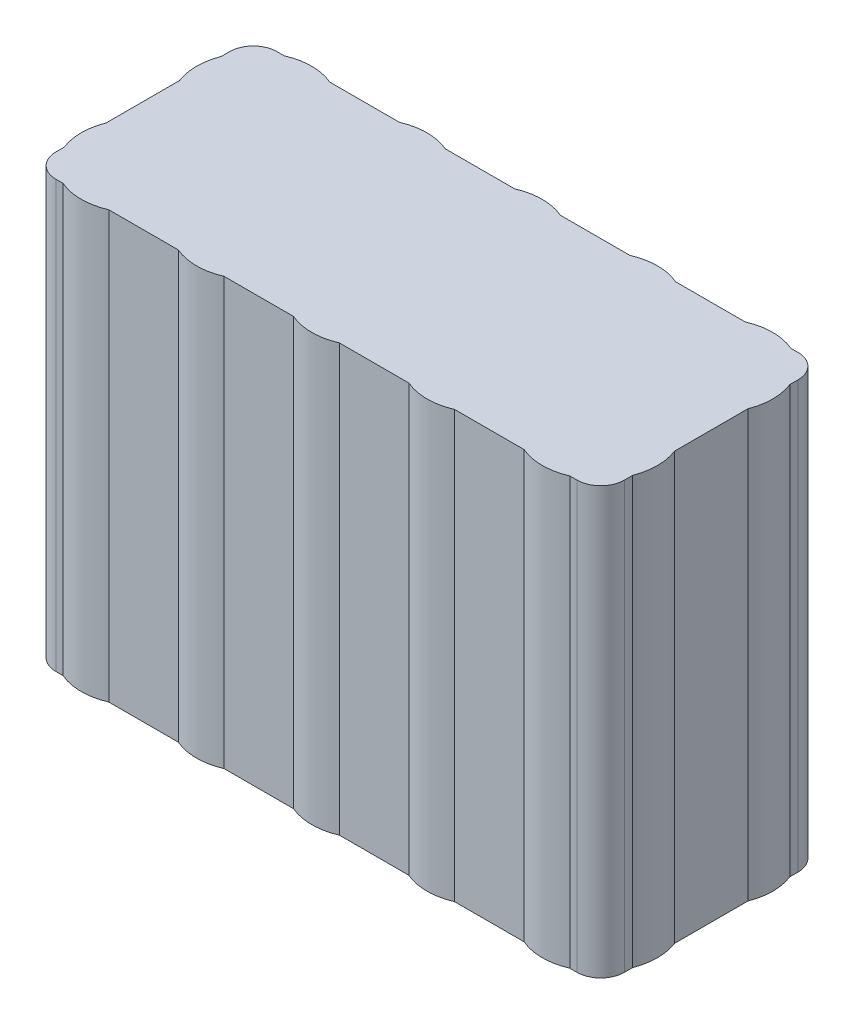
ISO-10303-21;
HEADER;
FILE_DESCRIPTION(('STEP AP214'),'2;1');
FILE_NAME('part.step','',(''),(''),'','','');
FILE_SCHEMA(('AUTOMOTIVE_DESIGN { 1 0 10303 214 1 1 1 1 }'));
ENDSEC;
DATA;
#1=APPLICATION_CONTEXT('core data for automotive mechanical design processes');
#2=APPLICATION_PROTOCOL_DEFINITION('international standard','automotive_design',2000,#1);
#3=PRODUCT_CONTEXT('',#1,'mechanical');
#4=PRODUCT('Part','Part','',(#3));
#5=PRODUCT_RELATED_PRODUCT_CATEGORY('part','',(#4));
#6=PRODUCT_DEFINITION_FORMATION('','',#4);
#7=PRODUCT_DEFINITION_CONTEXT('part definition',#1,'design');
#8=PRODUCT_DEFINITION('design','',#6,#7);
#9=PRODUCT_DEFINITION_SHAPE('','',#8);
#10=(LENGTH_UNIT() NAMED_UNIT(*) SI_UNIT(.MILLI.,.METRE.));
#11=(NAMED_UNIT(*) PLANE_ANGLE_UNIT() SI_UNIT($,.RADIAN.));
#12=(NAMED_UNIT(*) SI_UNIT($,.STERADIAN.) SOLID_ANGLE_UNIT());
#13=UNCERTAINTY_MEASURE_WITH_UNIT(LENGTH_MEASURE(1.E-05),#10,'distance_accuracy_value','');
#14=(GEOMETRIC_REPRESENTATION_CONTEXT(3) GLOBAL_UNCERTAINTY_ASSIGNED_CONTEXT((#13)) GLOBAL_UNIT_ASSIGNED_CONTEXT((#10,
#11,#12)) REPRESENTATION_CONTEXT('',''));
#15=CARTESIAN_POINT('',(0.,0.,0.));
#16=DIRECTION('',(0.,0.,1.));
#17=DIRECTION('',(1.,0.,0.));
#18=AXIS2_PLACEMENT_3D('',#15,#16,#17);
#19=CARTESIAN_POINT('',(-34.6305945179053,54.,0.));
#20=DIRECTION('',(-1.,0.,0.));
#21=DIRECTION('',(0.,0.,1.));
#22=AXIS2_PLACEMENT_3D('',#19,#20,#21);
#23=PLANE('',#22);
#24=DIRECTION('',(0.,-1.,0.));
#25=VECTOR('',#24,1.);
#26=CARTESIAN_POINT('',(-34.6305945179053,54.,-6.47462959398208));
#27=LINE('',#26,#25);
#28=CARTESIAN_POINT('',(-34.6305945179053,54.,-6.47462959398208));
#29=VERTEX_POINT('',#28);
#30=CARTESIAN_POINT('',(-34.6305945179053,0.,-6.47462959398208));
#31=VERTEX_POINT('',#30);
#32=EDGE_CURVE('E401',#29,#31,#27,.T.);
#33=ORIENTED_EDGE('',*,*,#32,.F.);
#34=DIRECTION('',(0.,0.,-1.));
#35=VECTOR('',#34,1.);
#36=CARTESIAN_POINT('',(-34.6305945179053,54.,0.));
#37=LINE('',#36,#35);
#38=CARTESIAN_POINT('',(-34.6305945179053,54.,-7.51944598451169));
#39=VERTEX_POINT('',#38);
#40=EDGE_CURVE('E659',#29,#39,#37,.T.);
#41=ORIENTED_EDGE('',*,*,#40,.T.);
#42=DIRECTION('',(0.,-1.,0.));
#43=VECTOR('',#42,1.);
#44=CARTESIAN_POINT('',(-34.6305945179053,54.,-7.51944598451169));
#45=LINE('',#44,#43);
#46=CARTESIAN_POINT('',(-34.6305945179053,0.,-7.51944598451169));
#47=VERTEX_POINT('',#46);
#48=EDGE_CURVE('E674',#39,#47,#45,.T.);
#49=ORIENTED_EDGE('',*,*,#48,.T.);
#50=DIRECTION('',(0.,0.,-1.));
#51=VECTOR('',#50,1.);
#52=CARTESIAN_POINT('',(-34.6305945179053,0.,0.));
#53=LINE('',#52,#51);
#54=EDGE_CURVE('E662',#31,#47,#53,.T.);
#55=ORIENTED_EDGE('',*,*,#54,.F.);
#56=EDGE_LOOP('',(#33,#41,#49,#55));
#57=FACE_BOUND('',#56,.T.);
#58=ADVANCED_FACE('F397',(#57),#23,.T.);
#59=CARTESIAN_POINT('',(0.,0.,0.));
#60=DIRECTION('',(0.,1.,0.));
#61=DIRECTION('',(0.,0.,1.));
#62=AXIS2_PLACEMENT_3D('',#59,#60,#61);
#63=PLANE('',#62);
#64=DIRECTION('',(1.,0.,0.));
#65=VECTOR('',#64,1.);
#66=CARTESIAN_POINT('',(-31.6305945179053,0.,17.4805540154883));
#67=LINE('',#66,#65);
#68=CARTESIAN_POINT('',(-10.3323191686675,0.,17.4805540154883));
#69=VERTEX_POINT('',#68);
#70=CARTESIAN_POINT('',(-1.52886986714318,0.,17.4805540154883));
#71=VERTEX_POINT('',#70);
#72=EDGE_CURVE('E1019',#69,#71,#67,.T.);
#73=ORIENTED_EDGE('',*,*,#72,.F.);
#74=CARTESIAN_POINT('',(-13.2305945179053,0.,10.7805540154883));
#75=DIRECTION('',(0.,1.,0.));
#76=DIRECTION('',(0.,0.,1.));
#77=AXIS2_PLACEMENT_3D('',#74,#75,#76);
#78=CIRCLE('',#77,7.3);
#79=CARTESIAN_POINT('',(-16.1288698671432,0.,17.4805540154883));
#80=VERTEX_POINT('',#79);
#81=EDGE_CURVE('E761',#80,#69,#78,.T.);
#82=ORIENTED_EDGE('',*,*,#81,.F.);
#83=CARTESIAN_POINT('',(-24.9323191686675,0.,17.4805540154883));
#84=VERTEX_POINT('',#83);
#85=EDGE_CURVE('E719',#84,#80,#67,.T.);
#86=ORIENTED_EDGE('',*,*,#85,.F.);
#87=CARTESIAN_POINT('',(-27.8305945179053,0.,10.7805540154883));
#88=DIRECTION('',(0.,1.,0.));
#89=DIRECTION('',(0.,0.,1.));
#90=AXIS2_PLACEMENT_3D('',#87,#88,#89);
#91=CIRCLE('',#90,7.3);
#92=CARTESIAN_POINT('',(-30.7288698671432,0.,17.4805540154883));
#93=VERTEX_POINT('',#92);
#94=EDGE_CURVE('E755',#93,#84,#91,.T.);
#95=ORIENTED_EDGE('',*,*,#94,.F.);
#96=CARTESIAN_POINT('',(-31.6305945179053,0.,17.4805540154883));
#97=VERTEX_POINT('',#96);
#98=EDGE_CURVE('E715',#97,#93,#67,.T.);
#99=ORIENTED_EDGE('',*,*,#98,.F.);
#100=CARTESIAN_POINT('',(-31.6305945179053,0.,14.4805540154883));
#101=DIRECTION('',(0.,1.,0.));
#102=DIRECTION('',(0.,0.,1.));
#103=AXIS2_PLACEMENT_3D('',#100,#101,#102);
#104=CIRCLE('',#103,3.);
#105=CARTESIAN_POINT('',(-34.6305945179053,0.,14.4805540154883));
#106=VERTEX_POINT('',#105);
#107=EDGE_CURVE('E710',#106,#97,#104,.T.);
#108=ORIENTED_EDGE('',*,*,#107,.F.);
#109=DIRECTION('',(0.,0.,-1.));
#110=VECTOR('',#109,1.);
#111=CARTESIAN_POINT('',(-34.6305945179053,0.,14.4805540154883));
#112=LINE('',#111,#110);
#113=CARTESIAN_POINT('',(-34.6305945179053,0.,13.4357376249586));
#114=VERTEX_POINT('',#113);
#115=EDGE_CURVE('E688',#106,#114,#112,.T.);
#116=ORIENTED_EDGE('',*,*,#115,.T.);
#117=CARTESIAN_POINT('',(-34.6305945179053,0.,8.12537040601791));
#118=VERTEX_POINT('',#117);
#119=EDGE_CURVE('E754',#118,#114,#91,.T.);
#120=ORIENTED_EDGE('',*,*,#119,.F.);
#121=CARTESIAN_POINT('',(-34.6305945179053,0.,-1.16426237504136));
#122=VERTEX_POINT('',#121);
#123=EDGE_CURVE('E657',#118,#122,#53,.T.);
#124=ORIENTED_EDGE('',*,*,#123,.T.);
#125=CARTESIAN_POINT('',(-27.8305945179053,0.,-3.81944598451172));
#126=DIRECTION('',(0.,1.,0.));
#127=DIRECTION('',(0.,0.,1.));
#128=AXIS2_PLACEMENT_3D('',#125,#126,#127);
#129=CIRCLE('',#128,7.3);
#130=EDGE_CURVE('E680',#31,#122,#129,.T.);
#131=ORIENTED_EDGE('',*,*,#130,.F.);
#132=ORIENTED_EDGE('',*,*,#54,.T.);
#133=CARTESIAN_POINT('',(-31.6305945179053,0.,-7.51944598451171));
#134=DIRECTION('',(0.,1.,0.));
#135=DIRECTION('',(0.,0.,1.));
#136=AXIS2_PLACEMENT_3D('',#133,#134,#135);
#137=CIRCLE('',#136,3.);
#138=CARTESIAN_POINT('',(-31.6305945179053,0.,-10.5194459845117));
#139=VERTEX_POINT('',#138);
#140=EDGE_CURVE('E670',#47,#139,#137,.F.);
#141=ORIENTED_EDGE('',*,*,#140,.T.);
#142=DIRECTION('',(1.,0.,0.));
#143=VECTOR('',#142,1.);
#144=CARTESIAN_POINT('',(0.,0.,-10.5194459845117));
#145=LINE('',#144,#143);
#146=CARTESIAN_POINT('',(-30.7288698671432,0.,-10.5194459845117));
#147=VERTEX_POINT('',#146);
#148=EDGE_CURVE('E650',#139,#147,#145,.T.);
#149=ORIENTED_EDGE('',*,*,#148,.T.);
#150=CARTESIAN_POINT('',(-24.9323191686674,0.,-10.5194459845117));
#151=VERTEX_POINT('',#150);
#152=EDGE_CURVE('E635',#151,#147,#129,.T.);
#153=ORIENTED_EDGE('',*,*,#152,.F.);
#154=DIRECTION('',(1.,0.,0.));
#155=VECTOR('',#154,1.);
#156=CARTESIAN_POINT('',(-31.6305945179053,0.,-10.5194459845117));
#157=LINE('',#156,#155);
#158=CARTESIAN_POINT('',(-16.1288698671432,0.,-10.5194459845117));
#159=VERTEX_POINT('',#158);
#160=EDGE_CURVE('E730',#151,#159,#157,.T.);
#161=ORIENTED_EDGE('',*,*,#160,.T.);
#162=CARTESIAN_POINT('',(-13.2305945179053,0.,-3.81944598451173));
#163=DIRECTION('',(0.,1.,0.));
#164=DIRECTION('',(0.,0.,1.));
#165=AXIS2_PLACEMENT_3D('',#162,#163,#164);
#166=CIRCLE('',#165,7.3);
#167=CARTESIAN_POINT('',(-10.3323191686674,0.,-10.5194459845117));
#168=VERTEX_POINT('',#167);
#169=EDGE_CURVE('E806',#168,#159,#166,.T.);
#170=ORIENTED_EDGE('',*,*,#169,.F.);
#171=CARTESIAN_POINT('',(-1.52886986714324,0.,-10.5194459845117));
#172=VERTEX_POINT('',#171);
#173=EDGE_CURVE('E732',#168,#172,#157,.T.);
#174=ORIENTED_EDGE('',*,*,#173,.T.);
#175=CARTESIAN_POINT('',(1.36940548209466,0.,-3.81944598451173));
#176=DIRECTION('',(0.,1.,0.));
#177=DIRECTION('',(0.,0.,1.));
#178=AXIS2_PLACEMENT_3D('',#175,#176,#177);
#179=CIRCLE('',#178,7.29999999999999);
#180=CARTESIAN_POINT('',(4.26768083133256,0.,-10.5194459845117));
#181=VERTEX_POINT('',#180);
#182=EDGE_CURVE('E801',#181,#172,#179,.T.);
#183=ORIENTED_EDGE('',*,*,#182,.F.);
#184=CARTESIAN_POINT('',(13.0711301328568,0.,-10.5194459845117));
#185=VERTEX_POINT('',#184);
#186=EDGE_CURVE('E879',#181,#185,#157,.T.);
#187=ORIENTED_EDGE('',*,*,#186,.T.);
#188=CARTESIAN_POINT('',(15.9694054820947,0.,-3.81944598451173));
#189=DIRECTION('',(0.,1.,0.));
#190=DIRECTION('',(0.,0.,1.));
#191=AXIS2_PLACEMENT_3D('',#188,#189,#190);
#192=CIRCLE('',#191,7.3);
#193=CARTESIAN_POINT('',(18.8676808313326,0.,-10.5194459845117));
#194=VERTEX_POINT('',#193);
#195=EDGE_CURVE('E795',#194,#185,#192,.T.);
#196=ORIENTED_EDGE('',*,*,#195,.F.);
#197=CARTESIAN_POINT('',(27.6711301328567,0.,-10.5194459845117));
#198=VERTEX_POINT('',#197);
#199=EDGE_CURVE('E881',#194,#198,#157,.T.);
#200=ORIENTED_EDGE('',*,*,#199,.T.);
#201=CARTESIAN_POINT('',(30.5694054820947,0.,-3.81944598451174));
#202=DIRECTION('',(0.,1.,0.));
#203=DIRECTION('',(0.,0.,1.));
#204=AXIS2_PLACEMENT_3D('',#201,#202,#203);
#205=CIRCLE('',#204,7.30000000000001);
#206=CARTESIAN_POINT('',(33.4676808313326,0.,-10.5194459845117));
#207=VERTEX_POINT('',#206);
#208=EDGE_CURVE('E789',#207,#198,#205,.T.);
#209=ORIENTED_EDGE('',*,*,#208,.F.);
#210=CARTESIAN_POINT('',(34.3694054820946,0.,-10.5194459845117));
#211=VERTEX_POINT('',#210);
#212=EDGE_CURVE('E729',#207,#211,#157,.T.);
#213=ORIENTED_EDGE('',*,*,#212,.T.);
#214=CARTESIAN_POINT('',(34.3694054820947,0.,-7.51944598451173));
#215=DIRECTION('',(0.,1.,0.));
#216=DIRECTION('',(0.,0.,1.));
#217=AXIS2_PLACEMENT_3D('',#214,#215,#216);
#218=CIRCLE('',#217,3.);
#219=CARTESIAN_POINT('',(37.3694054820947,0.,-7.5194459845117));
#220=VERTEX_POINT('',#219);
#221=EDGE_CURVE('E725',#220,#211,#218,.T.);
#222=ORIENTED_EDGE('',*,*,#221,.F.);
#223=DIRECTION('',(0.,0.,-1.));
#224=VECTOR('',#223,1.);
#225=CARTESIAN_POINT('',(37.3694054820947,0.,14.4805540154883));
#226=LINE('',#225,#224);
#227=CARTESIAN_POINT('',(37.3694054820947,0.,-6.47462959398212));
#228=VERTEX_POINT('',#227);
#229=EDGE_CURVE('E721',#228,#220,#226,.T.);
#230=ORIENTED_EDGE('',*,*,#229,.F.);
#231=CARTESIAN_POINT('',(37.3694054820947,0.,-1.16426237504136));
#232=VERTEX_POINT('',#231);
#233=EDGE_CURVE('E788',#232,#228,#205,.T.);
#234=ORIENTED_EDGE('',*,*,#233,.F.);
#235=CARTESIAN_POINT('',(37.3694054820947,0.,8.12537040601789));
#236=VERTEX_POINT('',#235);
#237=EDGE_CURVE('E726',#236,#232,#226,.T.);
#238=ORIENTED_EDGE('',*,*,#237,.F.);
#239=CARTESIAN_POINT('',(30.5694054820947,0.,10.7805540154883));
#240=DIRECTION('',(0.,1.,0.));
#241=DIRECTION('',(0.,0.,1.));
#242=AXIS2_PLACEMENT_3D('',#239,#240,#241);
#243=CIRCLE('',#242,7.30000000000001);
#244=CARTESIAN_POINT('',(37.3694054820947,0.,13.4357376249586));
#245=VERTEX_POINT('',#244);
#246=EDGE_CURVE('E781',#245,#236,#243,.T.);
#247=ORIENTED_EDGE('',*,*,#246,.F.);
#248=CARTESIAN_POINT('',(37.3694054820947,0.,14.4805540154883));
#249=VERTEX_POINT('',#248);
#250=EDGE_CURVE('E722',#249,#245,#226,.T.);
#251=ORIENTED_EDGE('',*,*,#250,.F.);
#252=CARTESIAN_POINT('',(34.3694054820947,0.,14.4805540154883));
#253=DIRECTION('',(0.,1.,0.));
#254=DIRECTION('',(0.,0.,1.));
#255=AXIS2_PLACEMENT_3D('',#252,#253,#254);
#256=CIRCLE('',#255,3.);
#257=CARTESIAN_POINT('',(34.3694054820946,0.,17.4805540154883));
#258=VERTEX_POINT('',#257);
#259=EDGE_CURVE('E718',#258,#249,#256,.T.);
#260=ORIENTED_EDGE('',*,*,#259,.F.);
#261=CARTESIAN_POINT('',(33.4676808313325,0.,17.4805540154883));
#262=VERTEX_POINT('',#261);
#263=EDGE_CURVE('E713',#262,#258,#67,.T.);
#264=ORIENTED_EDGE('',*,*,#263,.F.);
#265=CARTESIAN_POINT('',(27.6711301328568,0.,17.4805540154883));
#266=VERTEX_POINT('',#265);
#267=EDGE_CURVE('E780',#266,#262,#243,.T.);
#268=ORIENTED_EDGE('',*,*,#267,.F.);
#269=CARTESIAN_POINT('',(18.8676808313325,0.,17.4805540154883));
#270=VERTEX_POINT('',#269);
#271=EDGE_CURVE('E1015',#270,#266,#67,.T.);
#272=ORIENTED_EDGE('',*,*,#271,.F.);
#273=CARTESIAN_POINT('',(15.9694054820947,0.,10.7805540154883));
#274=DIRECTION('',(0.,1.,0.));
#275=DIRECTION('',(0.,0.,1.));
#276=AXIS2_PLACEMENT_3D('',#273,#274,#275);
#277=CIRCLE('',#276,7.3);
#278=CARTESIAN_POINT('',(13.0711301328568,0.,17.4805540154883));
#279=VERTEX_POINT('',#278);
#280=EDGE_CURVE('E773',#279,#270,#277,.T.);
#281=ORIENTED_EDGE('',*,*,#280,.F.);
#282=CARTESIAN_POINT('',(4.26768083133252,0.,17.4805540154883));
#283=VERTEX_POINT('',#282);
#284=EDGE_CURVE('E1018',#283,#279,#67,.T.);
#285=ORIENTED_EDGE('',*,*,#284,.F.);
#286=CARTESIAN_POINT('',(1.36940548209467,0.,10.7805540154883));
#287=DIRECTION('',(0.,1.,0.));
#288=DIRECTION('',(0.,0.,1.));
#289=AXIS2_PLACEMENT_3D('',#286,#287,#288);
#290=CIRCLE('',#289,7.3);
#291=EDGE_CURVE('E767',#71,#283,#290,.T.);
#292=ORIENTED_EDGE('',*,*,#291,.F.);
#293=EDGE_LOOP('',(#73,#82,#86,#95,#99,#108,#116,#120,#124,#131,#132,#141,#149,#153,#161,#170,
#174,#183,#187,#196,#200,#209,#213,#222,#230,#234,#238,#247,#251,#260,#264,#268,#272,#281,#285,#292));
#294=FACE_BOUND('',#293,.T.);
#295=ADVANCED_FACE('F858',(#294),#63,.F.);
#296=CARTESIAN_POINT('',(0.,54.,-10.5194459845117));
#297=DIRECTION('',(0.,0.,-1.));
#298=DIRECTION('',(-1.,0.,0.));
#299=AXIS2_PLACEMENT_3D('',#296,#297,#298);
#300=PLANE('',#299);
#301=DIRECTION('',(0.,-1.,0.));
#302=VECTOR('',#301,1.);
#303=CARTESIAN_POINT('',(-30.7288698671432,54.,-10.5194459845117));
#304=LINE('',#303,#302);
#305=CARTESIAN_POINT('',(-30.7288698671432,54.,-10.5194459845117));
#306=VERTEX_POINT('',#305);
#307=EDGE_CURVE('E12',#147,#306,#304,.F.);
#308=ORIENTED_EDGE('',*,*,#307,.F.);
#309=ORIENTED_EDGE('',*,*,#148,.F.);
#310=DIRECTION('',(0.,-1.,0.));
#311=VECTOR('',#310,1.);
#312=CARTESIAN_POINT('',(-31.6305945179053,54.,-10.5194459845117));
#313=LINE('',#312,#311);
#314=CARTESIAN_POINT('',(-31.6305945179053,54.,-10.5194459845117));
#315=VERTEX_POINT('',#314);
#316=EDGE_CURVE('E655',#315,#139,#313,.T.);
#317=ORIENTED_EDGE('',*,*,#316,.F.);
#318=DIRECTION('',(1.,0.,0.));
#319=VECTOR('',#318,1.);
#320=CARTESIAN_POINT('',(0.,54.,-10.5194459845117));
#321=LINE('',#320,#319);
#322=EDGE_CURVE('E646',#315,#306,#321,.T.);
#323=ORIENTED_EDGE('',*,*,#322,.T.);
#324=EDGE_LOOP('',(#308,#309,#317,#323));
#325=FACE_BOUND('',#324,.T.);
#326=ADVANCED_FACE('F654',(#325),#300,.T.);
#327=CARTESIAN_POINT('',(-31.6305945179053,54.,-7.51944598451171));
#328=DIRECTION('',(0.,-1.,0.));
#329=DIRECTION('',(0.,0.,-1.));
#330=AXIS2_PLACEMENT_3D('',#327,#328,#329);
#331=CYLINDRICAL_SURFACE('',#330,3.);
#332=ORIENTED_EDGE('',*,*,#140,.F.);
#333=ORIENTED_EDGE('',*,*,#48,.F.);
#334=CARTESIAN_POINT('',(-31.6305945179053,54.,-7.51944598451171));
#335=DIRECTION('',(0.,1.,0.));
#336=DIRECTION('',(0.,0.,1.));
#337=AXIS2_PLACEMENT_3D('',#334,#335,#336);
#338=CIRCLE('',#337,3.);
#339=EDGE_CURVE('E656',#39,#315,#338,.F.);
#340=ORIENTED_EDGE('',*,*,#339,.T.);
#341=ORIENTED_EDGE('',*,*,#316,.T.);
#342=EDGE_LOOP('',(#332,#333,#340,#341));
#343=FACE_BOUND('',#342,.T.);
#344=ADVANCED_FACE('F865',(#343),#331,.T.);
#345=DIRECTION('',(0.,-1.,0.));
#346=VECTOR('',#345,1.);
#347=CARTESIAN_POINT('',(-34.6305945179053,54.,-1.16426237504136));
#348=LINE('',#347,#346);
#349=CARTESIAN_POINT('',(-34.6305945179053,54.,-1.16426237504136));
#350=VERTEX_POINT('',#349);
#351=EDGE_CURVE('E407',#122,#350,#348,.F.);
#352=ORIENTED_EDGE('',*,*,#351,.F.);
#353=ORIENTED_EDGE('',*,*,#123,.F.);
#354=DIRECTION('',(0.,-1.,0.));
#355=VECTOR('',#354,1.);
#356=CARTESIAN_POINT('',(-34.6305945179053,54.,8.12537040601791));
#357=LINE('',#356,#355);
#358=CARTESIAN_POINT('',(-34.6305945179053,54.,8.12537040601791));
#359=VERTEX_POINT('',#358);
#360=EDGE_CURVE('E668',#359,#118,#357,.T.);
#361=ORIENTED_EDGE('',*,*,#360,.F.);
#362=EDGE_CURVE('E665',#359,#350,#37,.T.);
#363=ORIENTED_EDGE('',*,*,#362,.T.);
#364=EDGE_LOOP('',(#352,#353,#361,#363));
#365=FACE_BOUND('',#364,.T.);
#366=ADVANCED_FACE('F958',(#365),#23,.T.);
#367=CARTESIAN_POINT('',(0.,54.,0.));
#368=DIRECTION('',(0.,1.,0.));
#369=DIRECTION('',(0.,0.,1.));
#370=AXIS2_PLACEMENT_3D('',#367,#368,#369);
#371=PLANE('',#370);
#372=DIRECTION('',(1.,0.,0.));
#373=VECTOR('',#372,1.);
#374=CARTESIAN_POINT('',(-31.6305945179053,54.,17.4805540154883));
#375=LINE('',#374,#373);
#376=CARTESIAN_POINT('',(-24.9323191686675,54.,17.4805540154883));
#377=VERTEX_POINT('',#376);
#378=CARTESIAN_POINT('',(-16.1288698671432,54.,17.4805540154883));
#379=VERTEX_POINT('',#378);
#380=EDGE_CURVE('E693',#377,#379,#375,.T.);
#381=ORIENTED_EDGE('',*,*,#380,.T.);
#382=CARTESIAN_POINT('',(-13.2305945179053,54.,10.7805540154883));
#383=DIRECTION('',(0.,1.,0.));
#384=DIRECTION('',(0.,0.,1.));
#385=AXIS2_PLACEMENT_3D('',#382,#383,#384);
#386=CIRCLE('',#385,7.3);
#387=CARTESIAN_POINT('',(-10.3323191686675,54.,17.4805540154883));
#388=VERTEX_POINT('',#387);
#389=EDGE_CURVE('E758',#379,#388,#386,.T.);
#390=ORIENTED_EDGE('',*,*,#389,.T.);
#391=CARTESIAN_POINT('',(-1.52886986714318,54.,17.4805540154883));
#392=VERTEX_POINT('',#391);
#393=EDGE_CURVE('E1035',#388,#392,#375,.T.);
#394=ORIENTED_EDGE('',*,*,#393,.T.);
#395=CARTESIAN_POINT('',(1.36940548209467,54.,10.7805540154883));
#396=DIRECTION('',(0.,1.,0.));
#397=DIRECTION('',(0.,0.,1.));
#398=AXIS2_PLACEMENT_3D('',#395,#396,#397);
#399=CIRCLE('',#398,7.3);
#400=CARTESIAN_POINT('',(4.26768083133252,54.,17.4805540154883));
#401=VERTEX_POINT('',#400);
#402=EDGE_CURVE('E764',#392,#401,#399,.T.);
#403=ORIENTED_EDGE('',*,*,#402,.T.);
#404=CARTESIAN_POINT('',(13.0711301328568,54.,17.4805540154883));
#405=VERTEX_POINT('',#404);
#406=EDGE_CURVE('E1032',#401,#405,#375,.T.);
#407=ORIENTED_EDGE('',*,*,#406,.T.);
#408=CARTESIAN_POINT('',(15.9694054820947,54.,10.7805540154883));
#409=DIRECTION('',(0.,1.,0.));
#410=DIRECTION('',(0.,0.,1.));
#411=AXIS2_PLACEMENT_3D('',#408,#409,#410);
#412=CIRCLE('',#411,7.3);
#413=CARTESIAN_POINT('',(18.8676808313325,54.,17.4805540154883));
#414=VERTEX_POINT('',#413);
#415=EDGE_CURVE('E770',#405,#414,#412,.T.);
#416=ORIENTED_EDGE('',*,*,#415,.T.);
#417=CARTESIAN_POINT('',(27.6711301328568,54.,17.4805540154883));
#418=VERTEX_POINT('',#417);
#419=EDGE_CURVE('E1031',#414,#418,#375,.T.);
#420=ORIENTED_EDGE('',*,*,#419,.T.);
#421=CARTESIAN_POINT('',(30.5694054820947,54.,10.7805540154883));
#422=DIRECTION('',(0.,1.,0.));
#423=DIRECTION('',(0.,0.,1.));
#424=AXIS2_PLACEMENT_3D('',#421,#422,#423);
#425=CIRCLE('',#424,7.30000000000001);
#426=CARTESIAN_POINT('',(33.4676808313325,54.,17.4805540154883));
#427=VERTEX_POINT('',#426);
#428=EDGE_CURVE('E776',#418,#427,#425,.T.);
#429=ORIENTED_EDGE('',*,*,#428,.T.);
#430=CARTESIAN_POINT('',(34.3694054820946,54.,17.4805540154883));
#431=VERTEX_POINT('',#430);
#432=EDGE_CURVE('E687',#427,#431,#375,.T.);
#433=ORIENTED_EDGE('',*,*,#432,.T.);
#434=CARTESIAN_POINT('',(34.3694054820947,54.,14.4805540154883));
#435=DIRECTION('',(0.,1.,0.));
#436=DIRECTION('',(0.,0.,1.));
#437=AXIS2_PLACEMENT_3D('',#434,#435,#436);
#438=CIRCLE('',#437,3.);
#439=CARTESIAN_POINT('',(37.3694054820947,54.,14.4805540154883));
#440=VERTEX_POINT('',#439);
#441=EDGE_CURVE('E692',#431,#440,#438,.T.);
#442=ORIENTED_EDGE('',*,*,#441,.T.);
#443=DIRECTION('',(0.,0.,-1.));
#444=VECTOR('',#443,1.);
#445=CARTESIAN_POINT('',(37.3694054820947,54.,14.4805540154883));
#446=LINE('',#445,#444);
#447=CARTESIAN_POINT('',(37.3694054820947,54.,13.4357376249586));
#448=VERTEX_POINT('',#447);
#449=EDGE_CURVE('E696',#440,#448,#446,.T.);
#450=ORIENTED_EDGE('',*,*,#449,.T.);
#451=CARTESIAN_POINT('',(37.3694054820947,54.,8.12537040601789));
#452=VERTEX_POINT('',#451);
#453=EDGE_CURVE('E777',#448,#452,#425,.T.);
#454=ORIENTED_EDGE('',*,*,#453,.T.);
#455=CARTESIAN_POINT('',(37.3694054820947,54.,-1.16426237504136));
#456=VERTEX_POINT('',#455);
#457=EDGE_CURVE('E700',#452,#456,#446,.T.);
#458=ORIENTED_EDGE('',*,*,#457,.T.);
#459=CARTESIAN_POINT('',(30.5694054820947,54.,-3.81944598451174));
#460=DIRECTION('',(0.,1.,0.));
#461=DIRECTION('',(0.,0.,1.));
#462=AXIS2_PLACEMENT_3D('',#459,#460,#461);
#463=CIRCLE('',#462,7.30000000000001);
#464=CARTESIAN_POINT('',(37.3694054820947,54.,-6.47462959398212));
#465=VERTEX_POINT('',#464);
#466=EDGE_CURVE('E784',#456,#465,#463,.T.);
#467=ORIENTED_EDGE('',*,*,#466,.T.);
#468=CARTESIAN_POINT('',(37.3694054820947,54.,-7.5194459845117));
#469=VERTEX_POINT('',#468);
#470=EDGE_CURVE('E695',#465,#469,#446,.T.);
#471=ORIENTED_EDGE('',*,*,#470,.T.);
#472=CARTESIAN_POINT('',(34.3694054820947,54.,-7.51944598451173));
#473=DIRECTION('',(0.,1.,0.));
#474=DIRECTION('',(0.,0.,1.));
#475=AXIS2_PLACEMENT_3D('',#472,#473,#474);
#476=CIRCLE('',#475,3.);
#477=CARTESIAN_POINT('',(34.3694054820946,54.,-10.5194459845117));
#478=VERTEX_POINT('',#477);
#479=EDGE_CURVE('E699',#469,#478,#476,.T.);
#480=ORIENTED_EDGE('',*,*,#479,.T.);
#481=DIRECTION('',(1.,0.,0.));
#482=VECTOR('',#481,1.);
#483=CARTESIAN_POINT('',(-31.6305945179053,54.,-10.5194459845117));
#484=LINE('',#483,#482);
#485=CARTESIAN_POINT('',(33.4676808313326,54.,-10.5194459845117));
#486=VERTEX_POINT('',#485);
#487=EDGE_CURVE('E703',#486,#478,#484,.T.);
#488=ORIENTED_EDGE('',*,*,#487,.F.);
#489=CARTESIAN_POINT('',(27.6711301328567,54.,-10.5194459845117));
#490=VERTEX_POINT('',#489);
#491=EDGE_CURVE('E785',#486,#490,#463,.T.);
#492=ORIENTED_EDGE('',*,*,#491,.T.);
#493=CARTESIAN_POINT('',(18.8676808313326,54.,-10.5194459845117));
#494=VERTEX_POINT('',#493);
#495=EDGE_CURVE('E916',#494,#490,#484,.T.);
#496=ORIENTED_EDGE('',*,*,#495,.F.);
#497=CARTESIAN_POINT('',(15.9694054820947,54.,-3.81944598451173));
#498=DIRECTION('',(0.,1.,0.));
#499=DIRECTION('',(0.,0.,1.));
#500=AXIS2_PLACEMENT_3D('',#497,#498,#499);
#501=CIRCLE('',#500,7.3);
#502=CARTESIAN_POINT('',(13.0711301328568,54.,-10.5194459845117));
#503=VERTEX_POINT('',#502);
#504=EDGE_CURVE('E792',#494,#503,#501,.T.);
#505=ORIENTED_EDGE('',*,*,#504,.T.);
#506=CARTESIAN_POINT('',(4.26768083133256,54.,-10.5194459845117));
#507=VERTEX_POINT('',#506);
#508=EDGE_CURVE('E917',#507,#503,#484,.T.);
#509=ORIENTED_EDGE('',*,*,#508,.F.);
#510=CARTESIAN_POINT('',(1.36940548209466,54.,-3.81944598451173));
#511=DIRECTION('',(0.,1.,0.));
#512=DIRECTION('',(0.,0.,1.));
#513=AXIS2_PLACEMENT_3D('',#510,#511,#512);
#514=CIRCLE('',#513,7.29999999999999);
#515=CARTESIAN_POINT('',(-1.52886986714324,54.,-10.5194459845117));
#516=VERTEX_POINT('',#515);
#517=EDGE_CURVE('E798',#507,#516,#514,.T.);
#518=ORIENTED_EDGE('',*,*,#517,.T.);
#519=CARTESIAN_POINT('',(-10.3323191686674,54.,-10.5194459845117));
#520=VERTEX_POINT('',#519);
#521=EDGE_CURVE('E706',#520,#516,#484,.T.);
#522=ORIENTED_EDGE('',*,*,#521,.F.);
#523=CARTESIAN_POINT('',(-13.2305945179053,54.,-3.81944598451173));
#524=DIRECTION('',(0.,1.,0.));
#525=DIRECTION('',(0.,0.,1.));
#526=AXIS2_PLACEMENT_3D('',#523,#524,#525);
#527=CIRCLE('',#526,7.3);
#528=CARTESIAN_POINT('',(-16.1288698671432,54.,-10.5194459845117));
#529=VERTEX_POINT('',#528);
#530=EDGE_CURVE('E804',#520,#529,#527,.T.);
#531=ORIENTED_EDGE('',*,*,#530,.T.);
#532=CARTESIAN_POINT('',(-24.9323191686674,54.,-10.5194459845117));
#533=VERTEX_POINT('',#532);
#534=EDGE_CURVE('E649',#533,#529,#484,.T.);
#535=ORIENTED_EDGE('',*,*,#534,.F.);
#536=CARTESIAN_POINT('',(-27.8305945179053,54.,-3.81944598451172));
#537=DIRECTION('',(0.,1.,0.));
#538=DIRECTION('',(0.,0.,1.));
#539=AXIS2_PLACEMENT_3D('',#536,#537,#538);
#540=CIRCLE('',#539,7.3);
#541=EDGE_CURVE('E633',#533,#306,#540,.T.);
#542=ORIENTED_EDGE('',*,*,#541,.T.);
#543=ORIENTED_EDGE('',*,*,#322,.F.);
#544=ORIENTED_EDGE('',*,*,#339,.F.);
#545=ORIENTED_EDGE('',*,*,#40,.F.);
#546=EDGE_CURVE('E651',#29,#350,#540,.T.);
#547=ORIENTED_EDGE('',*,*,#546,.T.);
#548=ORIENTED_EDGE('',*,*,#362,.F.);
#549=CARTESIAN_POINT('',(-27.8305945179053,54.,10.7805540154883));
#550=DIRECTION('',(0.,1.,0.));
#551=DIRECTION('',(0.,0.,1.));
#552=AXIS2_PLACEMENT_3D('',#549,#550,#551);
#553=CIRCLE('',#552,7.3);
#554=CARTESIAN_POINT('',(-34.6305945179053,54.,13.4357376249586));
#555=VERTEX_POINT('',#554);
#556=EDGE_CURVE('E714',#359,#555,#553,.T.);
#557=ORIENTED_EDGE('',*,*,#556,.T.);
#558=DIRECTION('',(0.,0.,-1.));
#559=VECTOR('',#558,1.);
#560=CARTESIAN_POINT('',(-34.6305945179053,54.,14.4805540154883));
#561=LINE('',#560,#559);
#562=CARTESIAN_POINT('',(-34.6305945179053,54.,14.4805540154883));
#563=VERTEX_POINT('',#562);
#564=EDGE_CURVE('E705',#563,#555,#561,.T.);
#565=ORIENTED_EDGE('',*,*,#564,.F.);
#566=CARTESIAN_POINT('',(-31.6305945179053,54.,14.4805540154883));
#567=DIRECTION('',(0.,1.,0.));
#568=DIRECTION('',(0.,0.,1.));
#569=AXIS2_PLACEMENT_3D('',#566,#567,#568);
#570=CIRCLE('',#569,3.);
#571=CARTESIAN_POINT('',(-31.6305945179053,54.,17.4805540154883));
#572=VERTEX_POINT('',#571);
#573=EDGE_CURVE('E684',#563,#572,#570,.T.);
#574=ORIENTED_EDGE('',*,*,#573,.T.);
#575=CARTESIAN_POINT('',(-30.7288698671432,54.,17.4805540154883));
#576=VERTEX_POINT('',#575);
#577=EDGE_CURVE('E689',#572,#576,#375,.T.);
#578=ORIENTED_EDGE('',*,*,#577,.T.);
#579=EDGE_CURVE('E751',#576,#377,#553,.T.);
#580=ORIENTED_EDGE('',*,*,#579,.T.);
#581=EDGE_LOOP('',(#381,#390,#394,#403,#407,#416,#420,#429,#433,#442,#450,#454,#458,#467,#471,
#480,#488,#492,#496,#505,#509,#518,#522,#531,#535,#542,#543,#544,#545,#547,#548,#557,#565,#574,
#578,#580));
#582=FACE_BOUND('',#581,.T.);
#583=ADVANCED_FACE('F643',(#582),#371,.T.);
#584=CARTESIAN_POINT('',(30.5694054820947,54.,10.7805540154883));
#585=DIRECTION('',(0.,-1.,0.));
#586=DIRECTION('',(0.,0.,-1.));
#587=AXIS2_PLACEMENT_3D('',#584,#585,#586);
#588=CYLINDRICAL_SURFACE('',#587,7.30000000000001);
#589=ORIENTED_EDGE('',*,*,#246,.T.);
#590=DIRECTION('',(0.,-1.,0.));
#591=VECTOR('',#590,1.);
#592=CARTESIAN_POINT('',(37.3694054820947,54.,8.12537040601789));
#593=LINE('',#592,#591);
#594=EDGE_CURVE('E835',#236,#452,#593,.F.);
#595=ORIENTED_EDGE('',*,*,#594,.T.);
#596=ORIENTED_EDGE('',*,*,#453,.F.);
#597=DIRECTION('',(0.,-1.,0.));
#598=VECTOR('',#597,1.);
#599=CARTESIAN_POINT('',(37.3694054820947,54.,13.4357376249586));
#600=LINE('',#599,#598);
#601=EDGE_CURVE('E833',#448,#245,#600,.T.);
#602=ORIENTED_EDGE('',*,*,#601,.T.);
#603=EDGE_LOOP('',(#589,#595,#596,#602));
#604=FACE_BOUND('',#603,.T.);
#605=ADVANCED_FACE('F947',(#604),#588,.T.);
#606=CARTESIAN_POINT('',(34.3694054820947,54.,14.4805540154883));
#607=DIRECTION('',(0.,-1.,0.));
#608=DIRECTION('',(0.,0.,-1.));
#609=AXIS2_PLACEMENT_3D('',#606,#607,#608);
#610=CYLINDRICAL_SURFACE('',#609,3.);
#611=ORIENTED_EDGE('',*,*,#259,.T.);
#612=DIRECTION('',(0.,-1.,0.));
#613=VECTOR('',#612,1.);
#614=CARTESIAN_POINT('',(37.3694054820947,54.,14.4805540154883));
#615=LINE('',#614,#613);
#616=EDGE_CURVE('E742',#440,#249,#615,.T.);
#617=ORIENTED_EDGE('',*,*,#616,.F.);
#618=ORIENTED_EDGE('',*,*,#441,.F.);
#619=DIRECTION('',(0.,-1.,0.));
#620=VECTOR('',#619,1.);
#621=CARTESIAN_POINT('',(34.3694054820946,54.,17.4805540154883));
#622=LINE('',#621,#620);
#623=EDGE_CURVE('E745',#431,#258,#622,.T.);
#624=ORIENTED_EDGE('',*,*,#623,.T.);
#625=EDGE_LOOP('',(#611,#617,#618,#624));
#626=FACE_BOUND('',#625,.T.);
#627=ADVANCED_FACE('F977',(#626),#610,.T.);
#628=CARTESIAN_POINT('',(37.3694054820947,54.,14.4805540154883));
#629=DIRECTION('',(-1.,0.,0.));
#630=DIRECTION('',(0.,0.,1.));
#631=AXIS2_PLACEMENT_3D('',#628,#629,#630);
#632=PLANE('',#631);
#633=ORIENTED_EDGE('',*,*,#601,.F.);
#634=ORIENTED_EDGE('',*,*,#449,.F.);
#635=ORIENTED_EDGE('',*,*,#616,.T.);
#636=ORIENTED_EDGE('',*,*,#250,.T.);
#637=EDGE_LOOP('',(#633,#634,#635,#636));
#638=FACE_BOUND('',#637,.T.);
#639=ADVANCED_FACE('F976',(#638),#632,.F.);
#640=CARTESIAN_POINT('',(-31.6305945179053,54.,17.4805540154883));
#641=DIRECTION('',(0.,0.,-1.));
#642=DIRECTION('',(-1.,0.,0.));
#643=AXIS2_PLACEMENT_3D('',#640,#641,#642);
#644=PLANE('',#643);
#645=DIRECTION('',(0.,-1.,0.));
#646=VECTOR('',#645,1.);
#647=CARTESIAN_POINT('',(33.4676808313325,54.,17.4805540154883));
#648=LINE('',#647,#646);
#649=EDGE_CURVE('E839',#262,#427,#648,.F.);
#650=ORIENTED_EDGE('',*,*,#649,.F.);
#651=ORIENTED_EDGE('',*,*,#263,.T.);
#652=ORIENTED_EDGE('',*,*,#623,.F.);
#653=ORIENTED_EDGE('',*,*,#432,.F.);
#654=EDGE_LOOP('',(#650,#651,#652,#653));
#655=FACE_BOUND('',#654,.T.);
#656=ADVANCED_FACE('F944',(#655),#644,.F.);
#657=DIRECTION('',(0.,-1.,0.));
#658=VECTOR('',#657,1.);
#659=CARTESIAN_POINT('',(37.3694054820947,54.,-1.16426237504136));
#660=LINE('',#659,#658);
#661=EDGE_CURVE('E837',#456,#232,#660,.T.);
#662=ORIENTED_EDGE('',*,*,#661,.F.);
#663=ORIENTED_EDGE('',*,*,#457,.F.);
#664=ORIENTED_EDGE('',*,*,#594,.F.);
#665=ORIENTED_EDGE('',*,*,#237,.T.);
#666=EDGE_LOOP('',(#662,#663,#664,#665));
#667=FACE_BOUND('',#666,.T.);
#668=ADVANCED_FACE('F904',(#667),#632,.F.);
#669=CARTESIAN_POINT('',(30.5694054820947,54.,-3.81944598451174));
#670=DIRECTION('',(0.,-1.,0.));
#671=DIRECTION('',(0.,0.,-1.));
#672=AXIS2_PLACEMENT_3D('',#669,#670,#671);
#673=CYLINDRICAL_SURFACE('',#672,7.30000000000001);
#674=ORIENTED_EDGE('',*,*,#233,.T.);
#675=DIRECTION('',(0.,-1.,0.));
#676=VECTOR('',#675,1.);
#677=CARTESIAN_POINT('',(37.3694054820947,54.,-6.47462959398212));
#678=LINE('',#677,#676);
#679=EDGE_CURVE('E812',#228,#465,#678,.F.);
#680=ORIENTED_EDGE('',*,*,#679,.T.);
#681=ORIENTED_EDGE('',*,*,#466,.F.);
#682=ORIENTED_EDGE('',*,*,#661,.T.);
#683=EDGE_LOOP('',(#674,#680,#681,#682));
#684=FACE_BOUND('',#683,.T.);
#685=ADVANCED_FACE('F910',(#684),#673,.T.);
#686=CARTESIAN_POINT('',(34.3694054820947,54.,-7.51944598451173));
#687=DIRECTION('',(0.,-1.,0.));
#688=DIRECTION('',(0.,0.,-1.));
#689=AXIS2_PLACEMENT_3D('',#686,#687,#688);
#690=CYLINDRICAL_SURFACE('',#689,3.);
#691=ORIENTED_EDGE('',*,*,#221,.T.);
#692=DIRECTION('',(0.,-1.,0.));
#693=VECTOR('',#692,1.);
#694=CARTESIAN_POINT('',(34.3694054820946,54.,-10.5194459845117));
#695=LINE('',#694,#693);
#696=EDGE_CURVE('E736',#478,#211,#695,.T.);
#697=ORIENTED_EDGE('',*,*,#696,.F.);
#698=ORIENTED_EDGE('',*,*,#479,.F.);
#699=DIRECTION('',(0.,-1.,0.));
#700=VECTOR('',#699,1.);
#701=CARTESIAN_POINT('',(37.3694054820947,54.,-7.5194459845117));
#702=LINE('',#701,#700);
#703=EDGE_CURVE('E739',#469,#220,#702,.T.);
#704=ORIENTED_EDGE('',*,*,#703,.T.);
#705=EDGE_LOOP('',(#691,#697,#698,#704));
#706=FACE_BOUND('',#705,.T.);
#707=ADVANCED_FACE('F894',(#706),#690,.T.);
#708=ORIENTED_EDGE('',*,*,#679,.F.);
#709=ORIENTED_EDGE('',*,*,#229,.T.);
#710=ORIENTED_EDGE('',*,*,#703,.F.);
#711=ORIENTED_EDGE('',*,*,#470,.F.);
#712=EDGE_LOOP('',(#708,#709,#710,#711));
#713=FACE_BOUND('',#712,.T.);
#714=ADVANCED_FACE('F898',(#713),#632,.F.);
#715=CARTESIAN_POINT('',(-31.6305945179053,54.,-10.5194459845117));
#716=DIRECTION('',(0.,0.,-1.));
#717=DIRECTION('',(-1.,0.,0.));
#718=AXIS2_PLACEMENT_3D('',#715,#716,#717);
#719=PLANE('',#718);
#720=ORIENTED_EDGE('',*,*,#212,.F.);
#721=DIRECTION('',(0.,-1.,0.));
#722=VECTOR('',#721,1.);
#723=CARTESIAN_POINT('',(33.4676808313326,54.,-10.5194459845117));
#724=LINE('',#723,#722);
#725=EDGE_CURVE('E593',#207,#486,#724,.F.);
#726=ORIENTED_EDGE('',*,*,#725,.T.);
#727=ORIENTED_EDGE('',*,*,#487,.T.);
#728=ORIENTED_EDGE('',*,*,#696,.T.);
#729=EDGE_LOOP('',(#720,#726,#727,#728));
#730=FACE_BOUND('',#729,.T.);
#731=ADVANCED_FACE('F890',(#730),#719,.T.);
#732=ORIENTED_EDGE('',*,*,#267,.T.);
#733=ORIENTED_EDGE('',*,*,#649,.T.);
#734=ORIENTED_EDGE('',*,*,#428,.F.);
#735=DIRECTION('',(0.,-1.,0.));
#736=VECTOR('',#735,1.);
#737=CARTESIAN_POINT('',(27.6711301328568,54.,17.4805540154883));
#738=LINE('',#737,#736);
#739=EDGE_CURVE('E828',#418,#266,#738,.T.);
#740=ORIENTED_EDGE('',*,*,#739,.T.);
#741=EDGE_LOOP('',(#732,#733,#734,#740));
#742=FACE_BOUND('',#741,.T.);
#743=ADVANCED_FACE('F935',(#742),#588,.T.);
#744=ORIENTED_EDGE('',*,*,#725,.F.);
#745=ORIENTED_EDGE('',*,*,#208,.T.);
#746=DIRECTION('',(0.,-1.,0.));
#747=VECTOR('',#746,1.);
#748=CARTESIAN_POINT('',(27.6711301328567,54.,-10.5194459845117));
#749=LINE('',#748,#747);
#750=EDGE_CURVE('E845',#490,#198,#749,.T.);
#751=ORIENTED_EDGE('',*,*,#750,.F.);
#752=ORIENTED_EDGE('',*,*,#491,.F.);
#753=EDGE_LOOP('',(#744,#745,#751,#752));
#754=FACE_BOUND('',#753,.T.);
#755=ADVANCED_FACE('F932',(#754),#673,.T.);
#756=ORIENTED_EDGE('',*,*,#739,.F.);
#757=ORIENTED_EDGE('',*,*,#419,.F.);
#758=DIRECTION('',(0.,-1.,0.));
#759=VECTOR('',#758,1.);
#760=CARTESIAN_POINT('',(18.8676808313325,54.,17.4805540154883));
#761=LINE('',#760,#759);
#762=EDGE_CURVE('E826',#270,#414,#761,.F.);
#763=ORIENTED_EDGE('',*,*,#762,.F.);
#764=ORIENTED_EDGE('',*,*,#271,.T.);
#765=EDGE_LOOP('',(#756,#757,#763,#764));
#766=FACE_BOUND('',#765,.T.);
#767=ADVANCED_FACE('F934',(#766),#644,.F.);
#768=ORIENTED_EDGE('',*,*,#495,.T.);
#769=ORIENTED_EDGE('',*,*,#750,.T.);
#770=ORIENTED_EDGE('',*,*,#199,.F.);
#771=DIRECTION('',(0.,-1.,0.));
#772=VECTOR('',#771,1.);
#773=CARTESIAN_POINT('',(18.8676808313326,54.,-10.5194459845117));
#774=LINE('',#773,#772);
#775=EDGE_CURVE('E843',#194,#494,#774,.F.);
#776=ORIENTED_EDGE('',*,*,#775,.T.);
#777=EDGE_LOOP('',(#768,#769,#770,#776));
#778=FACE_BOUND('',#777,.T.);
#779=ADVANCED_FACE('F930',(#778),#719,.T.);
#780=CARTESIAN_POINT('',(15.9694054820947,54.,10.7805540154883));
#781=DIRECTION('',(0.,-1.,0.));
#782=DIRECTION('',(0.,0.,-1.));
#783=AXIS2_PLACEMENT_3D('',#780,#781,#782);
#784=CYLINDRICAL_SURFACE('',#783,7.3);
#785=ORIENTED_EDGE('',*,*,#280,.T.);
#786=ORIENTED_EDGE('',*,*,#762,.T.);
#787=ORIENTED_EDGE('',*,*,#415,.F.);
#788=DIRECTION('',(0.,-1.,0.));
#789=VECTOR('',#788,1.);
#790=CARTESIAN_POINT('',(13.0711301328568,54.,17.4805540154883));
#791=LINE('',#790,#789);
#792=EDGE_CURVE('E818',#405,#279,#791,.T.);
#793=ORIENTED_EDGE('',*,*,#792,.T.);
#794=EDGE_LOOP('',(#785,#786,#787,#793));
#795=FACE_BOUND('',#794,.T.);
#796=ADVANCED_FACE('F1001',(#795),#784,.T.);
#797=CARTESIAN_POINT('',(15.9694054820947,54.,-3.81944598451173));
#798=DIRECTION('',(0.,-1.,0.));
#799=DIRECTION('',(0.,0.,-1.));
#800=AXIS2_PLACEMENT_3D('',#797,#798,#799);
#801=CYLINDRICAL_SURFACE('',#800,7.3);
#802=ORIENTED_EDGE('',*,*,#775,.F.);
#803=ORIENTED_EDGE('',*,*,#195,.T.);
#804=DIRECTION('',(0.,-1.,0.));
#805=VECTOR('',#804,1.);
#806=CARTESIAN_POINT('',(13.0711301328568,54.,-10.5194459845117));
#807=LINE('',#806,#805);
#808=EDGE_CURVE('E832',#503,#185,#807,.T.);
#809=ORIENTED_EDGE('',*,*,#808,.F.);
#810=ORIENTED_EDGE('',*,*,#504,.F.);
#811=EDGE_LOOP('',(#802,#803,#809,#810));
#812=FACE_BOUND('',#811,.T.);
#813=ADVANCED_FACE('F929',(#812),#801,.T.);
#814=ORIENTED_EDGE('',*,*,#792,.F.);
#815=ORIENTED_EDGE('',*,*,#406,.F.);
#816=DIRECTION('',(0.,-1.,0.));
#817=VECTOR('',#816,1.);
#818=CARTESIAN_POINT('',(4.26768083133252,54.,17.4805540154883));
#819=LINE('',#818,#817);
#820=EDGE_CURVE('E816',#283,#401,#819,.F.);
#821=ORIENTED_EDGE('',*,*,#820,.F.);
#822=ORIENTED_EDGE('',*,*,#284,.T.);
#823=EDGE_LOOP('',(#814,#815,#821,#822));
#824=FACE_BOUND('',#823,.T.);
#825=ADVANCED_FACE('F943',(#824),#644,.F.);
#826=ORIENTED_EDGE('',*,*,#508,.T.);
#827=ORIENTED_EDGE('',*,*,#808,.T.);
#828=ORIENTED_EDGE('',*,*,#186,.F.);
#829=DIRECTION('',(0.,-1.,0.));
#830=VECTOR('',#829,1.);
#831=CARTESIAN_POINT('',(4.26768083133256,54.,-10.5194459845117));
#832=LINE('',#831,#830);
#833=EDGE_CURVE('E830',#181,#507,#832,.F.);
#834=ORIENTED_EDGE('',*,*,#833,.T.);
#835=EDGE_LOOP('',(#826,#827,#828,#834));
#836=FACE_BOUND('',#835,.T.);
#837=ADVANCED_FACE('F926',(#836),#719,.T.);
#838=CARTESIAN_POINT('',(1.36940548209467,54.,10.7805540154883));
#839=DIRECTION('',(0.,-1.,0.));
#840=DIRECTION('',(0.,0.,-1.));
#841=AXIS2_PLACEMENT_3D('',#838,#839,#840);
#842=CYLINDRICAL_SURFACE('',#841,7.3);
#843=ORIENTED_EDGE('',*,*,#291,.T.);
#844=ORIENTED_EDGE('',*,*,#820,.T.);
#845=ORIENTED_EDGE('',*,*,#402,.F.);
#846=DIRECTION('',(0.,-1.,0.));
#847=VECTOR('',#846,1.);
#848=CARTESIAN_POINT('',(-1.52886986714319,54.,17.4805540154883));
#849=LINE('',#848,#847);
#850=EDGE_CURVE('E814',#392,#71,#849,.T.);
#851=ORIENTED_EDGE('',*,*,#850,.T.);
#852=EDGE_LOOP('',(#843,#844,#845,#851));
#853=FACE_BOUND('',#852,.T.);
#854=ADVANCED_FACE('F997',(#853),#842,.T.);
#855=CARTESIAN_POINT('',(1.36940548209466,54.,-3.81944598451173));
#856=DIRECTION('',(0.,-1.,0.));
#857=DIRECTION('',(0.,0.,-1.));
#858=AXIS2_PLACEMENT_3D('',#855,#856,#857);
#859=CYLINDRICAL_SURFACE('',#858,7.29999999999999);
#860=ORIENTED_EDGE('',*,*,#833,.F.);
#861=ORIENTED_EDGE('',*,*,#182,.T.);
#862=DIRECTION('',(0.,-1.,0.));
#863=VECTOR('',#862,1.);
#864=CARTESIAN_POINT('',(-1.52886986714324,54.,-10.5194459845117));
#865=LINE('',#864,#863);
#866=EDGE_CURVE('E824',#516,#172,#865,.T.);
#867=ORIENTED_EDGE('',*,*,#866,.F.);
#868=ORIENTED_EDGE('',*,*,#517,.F.);
#869=EDGE_LOOP('',(#860,#861,#867,#868));
#870=FACE_BOUND('',#869,.T.);
#871=ADVANCED_FACE('F925',(#870),#859,.T.);
#872=CARTESIAN_POINT('',(-13.2305945179053,54.,10.7805540154883));
#873=DIRECTION('',(0.,-1.,0.));
#874=DIRECTION('',(0.,0.,-1.));
#875=AXIS2_PLACEMENT_3D('',#872,#873,#874);
#876=CYLINDRICAL_SURFACE('',#875,7.3);
#877=ORIENTED_EDGE('',*,*,#81,.T.);
#878=DIRECTION('',(0.,-1.,0.));
#879=VECTOR('',#878,1.);
#880=CARTESIAN_POINT('',(-10.3323191686675,54.,17.4805540154883));
#881=LINE('',#880,#879);
#882=EDGE_CURVE('E811',#69,#388,#881,.F.);
#883=ORIENTED_EDGE('',*,*,#882,.T.);
#884=ORIENTED_EDGE('',*,*,#389,.F.);
#885=DIRECTION('',(0.,-1.,0.));
#886=VECTOR('',#885,1.);
#887=CARTESIAN_POINT('',(-16.1288698671432,54.,17.4805540154883));
#888=LINE('',#887,#886);
#889=EDGE_CURVE('E809',#379,#80,#888,.T.);
#890=ORIENTED_EDGE('',*,*,#889,.T.);
#891=EDGE_LOOP('',(#877,#883,#884,#890));
#892=FACE_BOUND('',#891,.T.);
#893=ADVANCED_FACE('F993',(#892),#876,.T.);
#894=ORIENTED_EDGE('',*,*,#850,.F.);
#895=ORIENTED_EDGE('',*,*,#393,.F.);
#896=ORIENTED_EDGE('',*,*,#882,.F.);
#897=ORIENTED_EDGE('',*,*,#72,.T.);
#898=EDGE_LOOP('',(#894,#895,#896,#897));
#899=FACE_BOUND('',#898,.T.);
#900=ADVANCED_FACE('F987',(#899),#644,.F.);
#901=ORIENTED_EDGE('',*,*,#521,.T.);
#902=ORIENTED_EDGE('',*,*,#866,.T.);
#903=ORIENTED_EDGE('',*,*,#173,.F.);
#904=DIRECTION('',(0.,-1.,0.));
#905=VECTOR('',#904,1.);
#906=CARTESIAN_POINT('',(-10.3323191686674,54.,-10.5194459845117));
#907=LINE('',#906,#905);
#908=EDGE_CURVE('E822',#168,#520,#907,.F.);
#909=ORIENTED_EDGE('',*,*,#908,.T.);
#910=EDGE_LOOP('',(#901,#902,#903,#909));
#911=FACE_BOUND('',#910,.T.);
#912=ADVANCED_FACE('F878',(#911),#719,.T.);
#913=CARTESIAN_POINT('',(-27.8305945179053,54.,10.7805540154883));
#914=DIRECTION('',(0.,-1.,0.));
#915=DIRECTION('',(0.,0.,-1.));
#916=AXIS2_PLACEMENT_3D('',#913,#914,#915);
#917=CYLINDRICAL_SURFACE('',#916,7.3);
#918=ORIENTED_EDGE('',*,*,#94,.T.);
#919=DIRECTION('',(0.,-1.,0.));
#920=VECTOR('',#919,1.);
#921=CARTESIAN_POINT('',(-24.9323191686675,54.,17.4805540154883));
#922=LINE('',#921,#920);
#923=EDGE_CURVE('E683',#84,#377,#922,.F.);
#924=ORIENTED_EDGE('',*,*,#923,.T.);
#925=ORIENTED_EDGE('',*,*,#579,.F.);
#926=DIRECTION('',(0.,-1.,0.));
#927=VECTOR('',#926,1.);
#928=CARTESIAN_POINT('',(-30.7288698671432,54.,17.4805540154883));
#929=LINE('',#928,#927);
#930=EDGE_CURVE('E841',#576,#93,#929,.T.);
#931=ORIENTED_EDGE('',*,*,#930,.T.);
#932=EDGE_LOOP('',(#918,#924,#925,#931));
#933=FACE_BOUND('',#932,.T.);
#934=ADVANCED_FACE('F984',(#933),#917,.T.);
#935=ORIENTED_EDGE('',*,*,#923,.F.);
#936=ORIENTED_EDGE('',*,*,#85,.T.);
#937=ORIENTED_EDGE('',*,*,#889,.F.);
#938=ORIENTED_EDGE('',*,*,#380,.F.);
#939=EDGE_LOOP('',(#935,#936,#937,#938));
#940=FACE_BOUND('',#939,.T.);
#941=ADVANCED_FACE('F980',(#940),#644,.F.);
#942=CARTESIAN_POINT('',(-31.6305945179053,54.,14.4805540154883));
#943=DIRECTION('',(0.,-1.,0.));
#944=DIRECTION('',(0.,0.,-1.));
#945=AXIS2_PLACEMENT_3D('',#942,#943,#944);
#946=CYLINDRICAL_SURFACE('',#945,3.);
#947=ORIENTED_EDGE('',*,*,#107,.T.);
#948=DIRECTION('',(0.,-1.,0.));
#949=VECTOR('',#948,1.);
#950=CARTESIAN_POINT('',(-31.6305945179053,54.,17.4805540154883));
#951=LINE('',#950,#949);
#952=EDGE_CURVE('E748',#572,#97,#951,.T.);
#953=ORIENTED_EDGE('',*,*,#952,.F.);
#954=ORIENTED_EDGE('',*,*,#573,.F.);
#955=DIRECTION('',(0.,-1.,0.));
#956=VECTOR('',#955,1.);
#957=CARTESIAN_POINT('',(-34.6305945179053,54.,14.4805540154883));
#958=LINE('',#957,#956);
#959=EDGE_CURVE('E709',#563,#106,#958,.T.);
#960=ORIENTED_EDGE('',*,*,#959,.T.);
#961=EDGE_LOOP('',(#947,#953,#954,#960));
#962=FACE_BOUND('',#961,.T.);
#963=ADVANCED_FACE('F983',(#962),#946,.T.);
#964=ORIENTED_EDGE('',*,*,#930,.F.);
#965=ORIENTED_EDGE('',*,*,#577,.F.);
#966=ORIENTED_EDGE('',*,*,#952,.T.);
#967=ORIENTED_EDGE('',*,*,#98,.T.);
#968=EDGE_LOOP('',(#964,#965,#966,#967));
#969=FACE_BOUND('',#968,.T.);
#970=ADVANCED_FACE('F986',(#969),#644,.F.);
#971=CARTESIAN_POINT('',(-13.2305945179053,54.,-3.81944598451173));
#972=DIRECTION('',(0.,-1.,0.));
#973=DIRECTION('',(0.,0.,-1.));
#974=AXIS2_PLACEMENT_3D('',#971,#972,#973);
#975=CYLINDRICAL_SURFACE('',#974,7.3);
#976=ORIENTED_EDGE('',*,*,#908,.F.);
#977=ORIENTED_EDGE('',*,*,#169,.T.);
#978=DIRECTION('',(0.,-1.,0.));
#979=VECTOR('',#978,1.);
#980=CARTESIAN_POINT('',(-16.1288698671432,54.,-10.5194459845117));
#981=LINE('',#980,#979);
#982=EDGE_CURVE('E819',#529,#159,#981,.T.);
#983=ORIENTED_EDGE('',*,*,#982,.F.);
#984=ORIENTED_EDGE('',*,*,#530,.F.);
#985=EDGE_LOOP('',(#976,#977,#983,#984));
#986=FACE_BOUND('',#985,.T.);
#987=ADVANCED_FACE('F399',(#986),#975,.T.);
#988=CARTESIAN_POINT('',(-34.6305945179053,54.,14.4805540154883));
#989=DIRECTION('',(-1.,0.,0.));
#990=DIRECTION('',(0.,0.,1.));
#991=AXIS2_PLACEMENT_3D('',#988,#989,#990);
#992=PLANE('',#991);
#993=ORIENTED_EDGE('',*,*,#564,.T.);
#994=DIRECTION('',(0.,-1.,0.));
#995=VECTOR('',#994,1.);
#996=CARTESIAN_POINT('',(-34.6305945179053,54.,13.4357376249586));
#997=LINE('',#996,#995);
#998=EDGE_CURVE('E600',#555,#114,#997,.T.);
#999=ORIENTED_EDGE('',*,*,#998,.T.);
#1000=ORIENTED_EDGE('',*,*,#115,.F.);
#1001=ORIENTED_EDGE('',*,*,#959,.F.);
#1002=EDGE_LOOP('',(#993,#999,#1000,#1001));
#1003=FACE_BOUND('',#1002,.T.);
#1004=ADVANCED_FACE('F966',(#1003),#992,.T.);
#1005=DIRECTION('',(0.,-1.,0.));
#1006=VECTOR('',#1005,1.);
#1007=CARTESIAN_POINT('',(-24.9323191686674,54.,-10.5194459845117));
#1008=LINE('',#1007,#1006);
#1009=EDGE_CURVE('E609',#533,#151,#1008,.T.);
#1010=ORIENTED_EDGE('',*,*,#1009,.F.);
#1011=ORIENTED_EDGE('',*,*,#534,.T.);
#1012=ORIENTED_EDGE('',*,*,#982,.T.);
#1013=ORIENTED_EDGE('',*,*,#160,.F.);
#1014=EDGE_LOOP('',(#1010,#1011,#1012,#1013));
#1015=FACE_BOUND('',#1014,.T.);
#1016=ADVANCED_FACE('F869',(#1015),#719,.T.);
#1017=ORIENTED_EDGE('',*,*,#360,.T.);
#1018=ORIENTED_EDGE('',*,*,#119,.T.);
#1019=ORIENTED_EDGE('',*,*,#998,.F.);
#1020=ORIENTED_EDGE('',*,*,#556,.F.);
#1021=EDGE_LOOP('',(#1017,#1018,#1019,#1020));
#1022=FACE_BOUND('',#1021,.T.);
#1023=ADVANCED_FACE('F965',(#1022),#917,.T.);
#1024=CARTESIAN_POINT('',(-27.8305945179053,54.,-3.81944598451172));
#1025=DIRECTION('',(0.,-1.,0.));
#1026=DIRECTION('',(0.,0.,-1.));
#1027=AXIS2_PLACEMENT_3D('',#1024,#1025,#1026);
#1028=CYLINDRICAL_SURFACE('',#1027,7.3);
#1029=ORIENTED_EDGE('',*,*,#541,.F.);
#1030=ORIENTED_EDGE('',*,*,#1009,.T.);
#1031=ORIENTED_EDGE('',*,*,#152,.T.);
#1032=ORIENTED_EDGE('',*,*,#307,.T.);
#1033=EDGE_LOOP('',(#1029,#1030,#1031,#1032));
#1034=FACE_BOUND('',#1033,.T.);
#1035=ADVANCED_FACE('F632',(#1034),#1028,.T.);
#1036=ORIENTED_EDGE('',*,*,#546,.F.);
#1037=ORIENTED_EDGE('',*,*,#32,.T.);
#1038=ORIENTED_EDGE('',*,*,#130,.T.);
#1039=ORIENTED_EDGE('',*,*,#351,.T.);
#1040=EDGE_LOOP('',(#1036,#1037,#1038,#1039));
#1041=FACE_BOUND('',#1040,.T.);
#1042=ADVANCED_FACE('F854',(#1041),#1028,.T.);
#1043=CLOSED_SHELL('',(#58,#295,#326,#344,#366,#583,#605,#627,#639,#656,#668,#685,#707,#714,
#731,#743,#755,#767,#779,#796,#813,#825,#837,#854,#871,#893,#900,#912,#934,#941,#963,#970,#987,
#1004,#1016,#1023,#1035,#1042));
#1044=MANIFOLD_SOLID_BREP('B2',#1043);
#1045=ADVANCED_BREP_SHAPE_REPRESENTATION('',(#18,#1044),#14);
#1046=SHAPE_DEFINITION_REPRESENTATION(#9,#1045);
ENDSEC;
END-ISO-10303-21;
